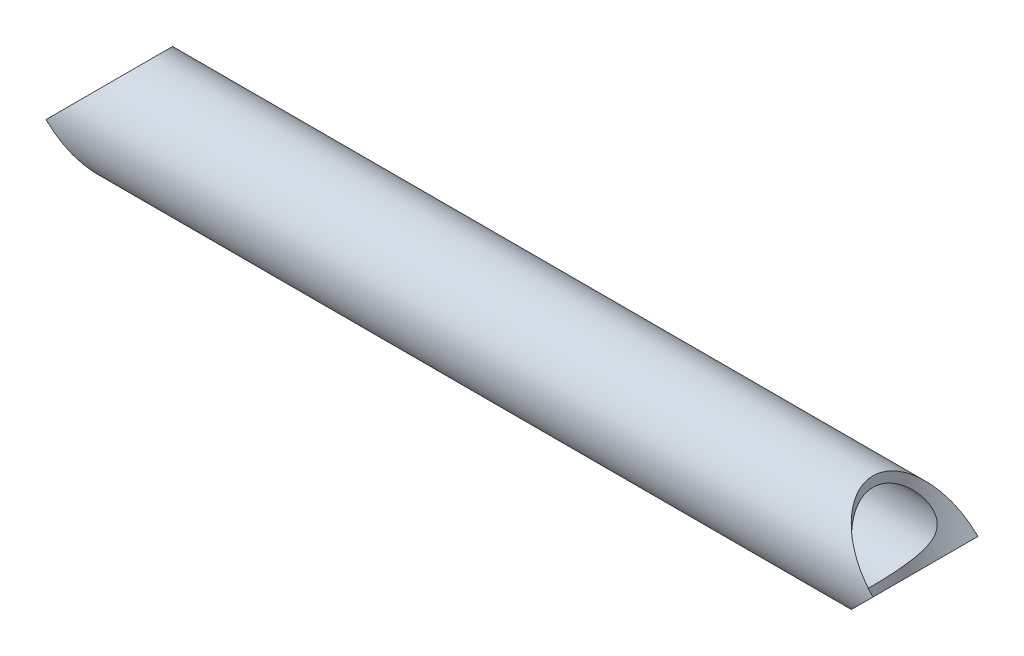
ISO-10303-21;
HEADER;
FILE_DESCRIPTION(('STEP AP214'),'2;1');
FILE_NAME('part.step','',(''),(''),'','','');
FILE_SCHEMA(('AUTOMOTIVE_DESIGN { 1 0 10303 214 1 1 1 1 }'));
ENDSEC;
DATA;
#1=APPLICATION_CONTEXT('core data for automotive mechanical design processes');
#2=APPLICATION_PROTOCOL_DEFINITION('international standard','automotive_design',2000,#1);
#3=PRODUCT_CONTEXT('',#1,'mechanical');
#4=PRODUCT('Part','Part','',(#3));
#5=PRODUCT_RELATED_PRODUCT_CATEGORY('part','',(#4));
#6=PRODUCT_DEFINITION_FORMATION('','',#4);
#7=PRODUCT_DEFINITION_CONTEXT('part definition',#1,'design');
#8=PRODUCT_DEFINITION('design','',#6,#7);
#9=PRODUCT_DEFINITION_SHAPE('','',#8);
#10=(LENGTH_UNIT() NAMED_UNIT(*) SI_UNIT(.MILLI.,.METRE.));
#11=(NAMED_UNIT(*) PLANE_ANGLE_UNIT() SI_UNIT($,.RADIAN.));
#12=(NAMED_UNIT(*) SI_UNIT($,.STERADIAN.) SOLID_ANGLE_UNIT());
#13=UNCERTAINTY_MEASURE_WITH_UNIT(LENGTH_MEASURE(1.E-05),#10,'distance_accuracy_value','');
#14=(GEOMETRIC_REPRESENTATION_CONTEXT(3) GLOBAL_UNCERTAINTY_ASSIGNED_CONTEXT((#13)) GLOBAL_UNIT_ASSIGNED_CONTEXT((#10,
#11,#12)) REPRESENTATION_CONTEXT('',''));
#15=CARTESIAN_POINT('',(0.,0.,0.));
#16=DIRECTION('',(0.,0.,1.));
#17=DIRECTION('',(1.,0.,0.));
#18=AXIS2_PLACEMENT_3D('',#15,#16,#17);
#19=CARTESIAN_POINT('',(-100.,0.,0.));
#20=DIRECTION('',(1.,0.,0.));
#21=DIRECTION('',(0.,0.,-1.));
#22=AXIS2_PLACEMENT_3D('',#19,#20,#21);
#23=CYLINDRICAL_SURFACE('',#22,10.287);
#24=CARTESIAN_POINT('',(-92.552340569011,0.,-10.287));
#25=CARTESIAN_POINT('',(-92.5523357977985,0.189932038780368,-10.2869980864713));
#26=CARTESIAN_POINT('',(-92.5450389268039,0.379911187093797,-10.2817259265039));
#27=CARTESIAN_POINT('',(-92.5162194889371,0.758278685140057,-10.2607666160381));
#28=CARTESIAN_POINT('',(-92.4946883791245,0.94666601070268,-10.2450732110122));
#29=CARTESIAN_POINT('',(-92.4383987012655,1.32078656545176,-10.2035975291257));
#30=CARTESIAN_POINT('',(-92.4036075793362,1.50651208602125,-10.1777904182559));
#31=CARTESIAN_POINT('',(-92.3223278414674,1.87380221431343,-10.1166164775326));
#32=CARTESIAN_POINT('',(-92.2758350072746,2.0553652957456,-10.0812461999905));
#33=CARTESIAN_POINT('',(-92.154363986474,2.47806526049302,-9.98718266907759));
#34=CARTESIAN_POINT('',(-92.0751550435284,2.71713958251239,-9.92467648900176));
#35=CARTESIAN_POINT('',(-91.9026167962832,3.18550993185475,-9.78441290578837));
#36=CARTESIAN_POINT('',(-91.8092809270585,3.4148013491253,-9.70664840695068));
#37=CARTESIAN_POINT('',(-91.6120732005586,3.86400179552905,-9.53675308851912));
#38=CARTESIAN_POINT('',(-91.5081760368868,4.08388640573903,-9.4445874640175));
#39=CARTESIAN_POINT('',(-91.2932416577878,4.51382894794119,-9.24682143685118));
#40=CARTESIAN_POINT('',(-91.1822046513382,4.72388716723352,-9.14122142731193));
#41=CARTESIAN_POINT('',(-90.9120483839777,5.21339845780271,-8.87399278060244));
#42=CARTESIAN_POINT('',(-90.7508549702148,5.4884843840778,-8.70643153948462));
#43=CARTESIAN_POINT('',(-90.4254493939977,6.02068558074217,-8.34726256890771));
#44=CARTESIAN_POINT('',(-90.2612361104094,6.27779399959522,-8.15564574839294));
#45=CARTESIAN_POINT('',(-89.9345828987323,6.77345348102332,-7.74889496500483));
#46=CARTESIAN_POINT('',(-89.7721415659063,7.01202032617912,-7.53378138624917));
#47=CARTESIAN_POINT('',(-89.4530080664348,7.46982637294642,-7.08010215713723));
#48=CARTESIAN_POINT('',(-89.2963139246712,7.68907225156216,-6.84154466936595));
#49=CARTESIAN_POINT('',(-89.0231566368179,8.06452061280443,-6.39167555919362));
#50=CARTESIAN_POINT('',(-88.9049550410172,8.22451787619024,-6.18457777068849));
#51=CARTESIAN_POINT('',(-88.6765955578563,8.53007401828669,-5.75582115307342));
#52=CARTESIAN_POINT('',(-88.5664360902512,8.67563573554793,-5.53416520093129));
#53=CARTESIAN_POINT('',(-88.3562366596023,8.95083608817968,-5.07700660806592));
#54=CARTESIAN_POINT('',(-88.2561847402022,9.08049357672919,-4.84152086109237));
#55=CARTESIAN_POINT('',(-88.0680379114325,9.32254717879241,-4.3572598713759));
#56=CARTESIAN_POINT('',(-87.9799409643452,9.43494623442593,-4.10848690353104));
#57=CARTESIAN_POINT('',(-87.8310418000741,9.62386124792222,-3.64092493675795));
#58=CARTESIAN_POINT('',(-87.768134317647,9.70323790298966,-3.4239592474859));
#59=CARTESIAN_POINT('',(-87.6530955196643,9.84785973139577,-2.98260436332996));
#60=CARTESIAN_POINT('',(-87.6009621134074,9.91310764652366,-2.75821661851252));
#61=CARTESIAN_POINT('',(-87.5084564322107,10.0285703455491,-2.30330043634013));
#62=CARTESIAN_POINT('',(-87.4680801602233,10.0787902386519,-2.07277411506213));
#63=CARTESIAN_POINT('',(-87.3998826974806,10.1634617833374,-1.60699613295693));
#64=CARTESIAN_POINT('',(-87.3720616550315,10.1979132486587,-1.37174441634619));
#65=CARTESIAN_POINT('',(-87.3294957735547,10.2505750218097,-0.897353246506913));
#66=CARTESIAN_POINT('',(-87.3147999972701,10.2687243932203,-0.658202580892907));
#67=CARTESIAN_POINT('',(-87.2989934173221,10.28824427429,-0.178765281690051));
#68=CARTESIAN_POINT('',(-87.297882640544,10.2896147507427,0.0615213541460107));
#69=CARTESIAN_POINT('',(-87.3092712637118,10.2755526164506,0.541278083178366));
#70=CARTESIAN_POINT('',(-87.3217708438044,10.2601197832973,0.78074816552467));
#71=CARTESIAN_POINT('',(-87.3600981544274,10.2127215784355,1.25695705785821));
#72=CARTESIAN_POINT('',(-87.385925535751,10.1807566398909,1.49369593924052));
#73=CARTESIAN_POINT('',(-87.4484554669451,10.1031743830642,1.94894984792973));
#74=CARTESIAN_POINT('',(-87.4844335617574,10.0584649582386,2.1677208797139));
#75=CARTESIAN_POINT('',(-87.5670541198071,9.95547375714236,2.60005985186142));
#76=CARTESIAN_POINT('',(-87.6137002396975,9.89718732698737,2.81362598031304));
#77=CARTESIAN_POINT('',(-87.71684091723,9.76779870432678,3.23433238529809));
#78=CARTESIAN_POINT('',(-87.7733333854667,9.69669923065367,3.44147401415406));
#79=CARTESIAN_POINT('',(-87.8953013614415,9.54244864751585,3.84856473312265));
#80=CARTESIAN_POINT('',(-87.9607801615503,9.45929312037722,4.04851115304196));
#81=CARTESIAN_POINT('',(-88.106237120147,9.27349005922084,4.45870395517475));
#82=CARTESIAN_POINT('',(-88.1869974486118,9.16974888392017,4.66817825019073));
#83=CARTESIAN_POINT('',(-88.356853006859,8.94986555558706,5.07702819229357));
#84=CARTESIAN_POINT('',(-88.4459516659965,8.83371829743013,5.27639963189504));
#85=CARTESIAN_POINT('',(-88.7238962232386,8.46806724593112,5.85868330580118));
#86=CARTESIAN_POINT('',(-88.923448114438,8.20128177036337,6.22592241385102));
#87=CARTESIAN_POINT('',(-89.2578912741026,7.74204241042251,6.77912554925745));
#88=CARTESIAN_POINT('',(-89.3870781203666,7.56201452512019,6.97926547149273));
#89=CARTESIAN_POINT('',(-89.6499548770561,7.18842484325605,7.36346838310403));
#90=CARTESIAN_POINT('',(-89.7836455020296,6.99486089383663,7.5475288045804));
#91=CARTESIAN_POINT('',(-90.053368304194,6.59467509214191,7.89960646030997));
#92=CARTESIAN_POINT('',(-90.1894032631165,6.38803682036848,8.06760282811604));
#93=CARTESIAN_POINT('',(-90.4611668468746,5.96226329985451,8.38717042900703));
#94=CARTESIAN_POINT('',(-90.5968955015107,5.74312932659368,8.53874333392775));
#95=CARTESIAN_POINT('',(-90.8562512705121,5.30745378213158,8.81563383816064));
#96=CARTESIAN_POINT('',(-90.9800809157422,5.09171774322298,8.94202913421709));
#97=CARTESIAN_POINT('',(-91.2223026545912,4.64915627123924,9.17991473059046));
#98=CARTESIAN_POINT('',(-91.3406939314385,4.42232918292647,9.29140279681054));
#99=CARTESIAN_POINT('',(-91.5684871296383,3.95774051111548,9.49859209609348));
#100=CARTESIAN_POINT('',(-91.6779039589112,3.71999812839915,9.5943197874537));
#101=CARTESIAN_POINT('',(-91.8838463633274,3.23309675890485,9.76914962163559));
#102=CARTESIAN_POINT('',(-91.9803785440486,2.98394371071973,9.84826029553734));
#103=CARTESIAN_POINT('',(-92.1269220469652,2.5580357417044,9.96545810928555));
#104=CARTESIAN_POINT('',(-92.1818117292563,2.38431288877448,10.008493053683));
#105=CARTESIAN_POINT('',(-92.281898049268,2.03222306759326,10.085876460149));
#106=CARTESIAN_POINT('',(-92.3270979502389,1.8538576855821,10.1202278472998));
#107=CARTESIAN_POINT('',(-92.4061090675009,1.49344632778608,10.1796497879095));
#108=CARTESIAN_POINT('',(-92.4399423672013,1.31140822587645,10.2047383469975));
#109=CARTESIAN_POINT('',(-92.4949024275909,0.944334965128806,10.2452273903117));
#110=CARTESIAN_POINT('',(-92.5160295207486,0.759299884839344,10.2606281280283));
#111=CARTESIAN_POINT('',(-92.5446651980679,0.386265398595414,10.2814544791157));
#112=CARTESIAN_POINT('',(-92.5520752237122,0.198254254752728,10.2868079053105));
#113=CARTESIAN_POINT('',(-92.5525918580423,-0.177792607936595,10.2871819197326));
#114=CARTESIAN_POINT('',(-92.5456988299599,-0.365828326037898,10.2822027703598));
#115=CARTESIAN_POINT('',(-92.5179527798881,-0.740507651821639,10.2620299180487));
#116=CARTESIAN_POINT('',(-92.4970844429812,-0.927149504897394,10.246825009079));
#117=CARTESIAN_POINT('',(-92.442393957883,-1.29743738558184,10.2065534202554));
#118=CARTESIAN_POINT('',(-92.4085698036928,-1.48108294466968,10.1814852132128));
#119=CARTESIAN_POINT('',(-92.320436127666,-1.8855702790072,10.1152353436888));
#120=CARTESIAN_POINT('',(-92.263219041822,-2.10538972701462,10.0716873800548));
#121=CARTESIAN_POINT('',(-92.1345498184328,-2.53778726680189,9.97152552255302));
#122=CARTESIAN_POINT('',(-92.0630905748703,-2.75036168147748,9.9149051040392));
#123=CARTESIAN_POINT('',(-91.9088110784812,-3.16820342450253,9.78941075306115));
#124=CARTESIAN_POINT('',(-91.8259635735779,-3.3734516908193,9.72050730626211));
#125=CARTESIAN_POINT('',(-91.6517717162026,-3.77600333383638,9.57132435513086));
#126=CARTESIAN_POINT('',(-91.5604269175143,-3.9733062925261,9.49104425326294));
#127=CARTESIAN_POINT('',(-91.3244819230388,-4.456580893282,9.27695087548648));
#128=CARTESIAN_POINT('',(-91.1760382275709,-4.73770956677506,9.13640455258402));
#129=CARTESIAN_POINT('',(-90.871655789844,-5.28300727582608,8.83231020337093));
#130=CARTESIAN_POINT('',(-90.7157136680097,-5.54716853640638,8.66875174019354));
#131=CARTESIAN_POINT('',(-90.4011519622603,-6.05896086125925,8.31910381795196));
#132=CARTESIAN_POINT('',(-90.2425296428146,-6.30657357641017,8.13298997192597));
#133=CARTESIAN_POINT('',(-89.9269452530042,-6.78461437241087,7.73869154256376));
#134=CARTESIAN_POINT('',(-89.7699829068158,-7.01504534796445,7.53051069135606));
#135=CARTESIAN_POINT('',(-89.4582328051086,-7.46240290838807,7.08773158460243));
#136=CARTESIAN_POINT('',(-89.3035535257691,-7.67896133390047,6.85268358287048));
#137=CARTESIAN_POINT('',(-89.0033894544433,-8.09184076525126,6.35985883493025));
#138=CARTESIAN_POINT('',(-88.8579061643975,-8.28815846854912,6.102078392315));
#139=CARTESIAN_POINT('',(-88.5802153164672,-8.65786874998211,5.56503943044338));
#140=CARTESIAN_POINT('',(-88.4479732521329,-8.83132130912193,5.28584027343918));
#141=CARTESIAN_POINT('',(-88.2000792532639,-9.15319780581288,4.70648419838273));
#142=CARTESIAN_POINT('',(-88.0844182192624,-9.30163547913932,4.40633891082294));
#143=CARTESIAN_POINT('',(-87.906989533717,-9.52766879850989,3.88572351480877));
#144=CARTESIAN_POINT('',(-87.8397902153676,-9.61276922730955,3.67032686788154));
#145=CARTESIAN_POINT('',(-87.7159195356389,-9.7689954440067,3.2316057777219));
#146=CARTESIAN_POINT('',(-87.6592454153687,-9.84012489429393,3.0082834303265));
#147=CARTESIAN_POINT('',(-87.5574871149742,-9.96744493324417,2.55495785129186));
#148=CARTESIAN_POINT('',(-87.5123968750543,-10.0236433332127,2.32495818309123));
#149=CARTESIAN_POINT('',(-87.4346670137601,-10.1203156567961,1.85958387171439));
#150=CARTESIAN_POINT('',(-87.4020277981122,-10.1607890680006,1.62420905364958));
#151=CARTESIAN_POINT('',(-87.3497874068493,-10.2254884602312,1.14872542171499));
#152=CARTESIAN_POINT('',(-87.3302442396564,-10.2496421575973,0.90860033329174));
#153=CARTESIAN_POINT('',(-87.3048694821257,-10.2809918293724,0.426519171892953));
#154=CARTESIAN_POINT('',(-87.2990378459638,-10.2881878604542,0.184563105039288));
#155=CARTESIAN_POINT('',(-87.3012207857148,-10.2854928403239,-0.29918606296353));
#156=CARTESIAN_POINT('',(-87.3092351585233,-10.2756020397554,-0.540979166451114));
#157=CARTESIAN_POINT('',(-87.3389251373345,-10.2389111736869,-1.0224221306238));
#158=CARTESIAN_POINT('',(-87.3606002845433,-10.2121116760615,-1.26207206301267));
#159=CARTESIAN_POINT('',(-87.4152554774901,-10.1443843583008,-1.72168291687353));
#160=CARTESIAN_POINT('',(-87.4473959225501,-10.1045045743678,-1.9419001892282));
#161=CARTESIAN_POINT('',(-87.5225769696254,-10.0109554755136,-2.37756077115247));
#162=CARTESIAN_POINT('',(-87.5656212636851,-9.95728148978452,-2.59300243677641));
#163=CARTESIAN_POINT('',(-87.6618456299882,-9.83685583678935,-3.01784451352763));
#164=CARTESIAN_POINT('',(-87.7150248322908,-9.77010529195024,-3.22724544139331));
#165=CARTESIAN_POINT('',(-87.8306624535782,-9.62429818740119,-3.63909198727334));
#166=CARTESIAN_POINT('',(-87.8931221032795,-9.54523999545924,-3.84153667840289));
#167=CARTESIAN_POINT('',(-88.0317314834575,-9.368833324329,-4.25461076280862));
#168=CARTESIAN_POINT('',(-88.1085768380345,-9.27052735131761,-4.46459824130135));
#169=CARTESIAN_POINT('',(-88.2707741456757,-9.06153570630371,-4.87483108046095));
#170=CARTESIAN_POINT('',(-88.3561265391496,-8.95084939333415,-5.07507593595235));
#171=CARTESIAN_POINT('',(-88.623207476573,-8.60153904994493,-5.66059464225386));
#172=CARTESIAN_POINT('',(-88.8160033269466,-8.34560887235322,-6.03077888833571));
#173=CARTESIAN_POINT('',(-89.1400502778151,-7.90464395913558,-6.58865181596339));
#174=CARTESIAN_POINT('',(-89.2651428383055,-7.7320974867895,-6.79019609286956));
#175=CARTESIAN_POINT('',(-89.5203231705343,-7.37372683550692,-7.17775105621994));
#176=CARTESIAN_POINT('',(-89.6504103641271,-7.18790419120179,-7.36376353265673));
#177=CARTESIAN_POINT('',(-89.9136410569868,-6.80343135689891,-7.72040054485716));
#178=CARTESIAN_POINT('',(-90.0467890116567,-6.60476158898695,-7.89100059777087));
#179=CARTESIAN_POINT('',(-90.3136715778325,-6.19527685832252,-8.21640427541267));
#180=CARTESIAN_POINT('',(-90.4474061497121,-5.98446270460562,-8.37120895049876));
#181=CARTESIAN_POINT('',(-90.7127012447032,-5.55117899543202,-8.66459002554809));
#182=CARTESIAN_POINT('',(-90.8442650899824,-5.32872995542221,-8.80319368294449));
#183=CARTESIAN_POINT('',(-91.1025136875211,-4.87167555130491,-9.06412854269739));
#184=CARTESIAN_POINT('',(-91.2291974197734,-4.63706766961733,-9.18645635616172));
#185=CARTESIAN_POINT('',(-91.4738712575166,-4.15573105229372,-9.41397823295496));
#186=CARTESIAN_POINT('',(-91.5918733369115,-3.90901982404247,-9.51919614672524));
#187=CARTESIAN_POINT('',(-91.8147998253919,-3.40315983807797,-9.71154758550382));
#188=CARTESIAN_POINT('',(-91.9197321116809,-3.14401870364818,-9.79869202472296));
#189=CARTESIAN_POINT('',(-92.1418548445237,-2.52771364546421,-9.97827900178999));
#190=CARTESIAN_POINT('',(-92.2521988728687,-2.16574811286747,-10.0634713101814));
#191=CARTESIAN_POINT('',(-92.382403162402,-1.61014331534324,-10.1619468321322));
#192=CARTESIAN_POINT('',(-92.4198929219675,-1.42308824751273,-10.1898688536328));
#193=CARTESIAN_POINT('',(-92.4815983590666,-1.04560404077382,-10.2354838849534));
#194=CARTESIAN_POINT('',(-92.5058227165629,-0.855177192550054,-10.2531835839704));
#195=CARTESIAN_POINT('',(-92.5326016618138,-0.553617252295103,-10.2726868111946));
#196=CARTESIAN_POINT('',(-92.539989489433,-0.443113571684794,-10.2780485043509));
#197=CARTESIAN_POINT('',(-92.5498609016736,-0.221745330807059,-10.285206068797));
#198=CARTESIAN_POINT('',(-92.5523433544038,-0.11088069316035,-10.2870011171016));
#199=CARTESIAN_POINT('',(-92.552340569011,0.,-10.287));
#200=B_SPLINE_CURVE_WITH_KNOTS('',3,(#24,#25,#26,#27,#28,#29,#30,#31,#32,#33,#34,#35,#36,#37,
#38,#39,#40,#41,#42,#43,#44,#45,#46,#47,#48,#49,#50,#51,#52,#53,#54,#55,#56,#57,#58,#59,#60,#61,
#62,#63,#64,#65,#66,#67,#68,#69,#70,#71,#72,#73,#74,#75,#76,#77,#78,#79,#80,#81,#82,#83,#84,#85,
#86,#87,#88,#89,#90,#91,#92,#93,#94,#95,#96,#97,#98,#99,#100,#101,#102,#103,#104,#105,#106,#107,
#108,#109,#110,#111,#112,#113,#114,#115,#116,#117,#118,#119,#120,#121,#122,#123,#124,#125,#126,
#127,#128,#129,#130,#131,#132,#133,#134,#135,#136,#137,#138,#139,#140,#141,#142,#143,#144,#145,
#146,#147,#148,#149,#150,#151,#152,#153,#154,#155,#156,#157,#158,#159,#160,#161,#162,#163,#164,
#165,#166,#167,#168,#169,#170,#171,#172,#173,#174,#175,#176,#177,#178,#179,#180,#181,#182,#183,
#184,#185,#186,#187,#188,#189,#190,#191,#192,#193,#194,#195,#196,#197,#198,#199),.UNSPECIFIED.,
.T.,.F.,(4,2,2,2,2,2,2,2,2,2,2,2,2,2,2,2,2,2,2,2,2,2,2,2,2,2,2,2,2,2,2,2,2,2,2,2,2,2,2,2,2,2,2,
2,2,2,2,2,2,2,2,2,2,2,2,2,2,2,2,2,2,2,2,2,2,2,2,2,2,2,2,2,2,2,2,2,2,2,2,2,2,2,2,2,2,2,2,4),(0.,
0.569669790461824,1.13968178949951,1.71110230118809,2.28272909528938,3.05996911196589,
3.83757143523043,4.61708301012321,5.39657177970072,6.47572664974661,7.55529058740046,
8.63392530079339,9.71218578211876,10.5728967918908,11.4334382177549,12.2929494754071,
13.1523140453827,13.8699194110019,14.5873853948057,15.3046071777089,16.021837432436,
16.7417376340033,17.4616392602954,18.1815504153245,18.9014427086509,19.5792280401887,
20.2572460436827,20.9351203458408,21.6132436707789,22.3544487809388,23.0959600819772,
24.578439561217,25.473585819129,26.3688747717472,27.2653112990452,28.1616564871742,
28.9980963863368,29.8346614997935,30.6698075537227,31.5045237948634,32.065693756976,
32.6266744346484,33.1865588310989,33.7464285770695,34.310305659209,34.8741684216424,
35.4386501094645,36.0032192335034,36.6959797271646,37.3890867376777,38.0838822011838,
38.7787141709447,39.8200103936678,40.8617804147451,41.9046870222231,42.9474175265166,
44.0112726530454,45.0753010877656,46.136480275765,47.1970748537868,47.9198454014615,
48.642426226514,49.3646282795771,50.0868538641477,50.8122577372525,51.5376591860412,
52.2630499941405,52.9884164414556,53.6659568183127,54.3437269177826,55.0214388662977,
55.6992407692071,56.4312960728101,57.1633892946535,58.6271465132391,59.5065221966277,
60.3857963943709,61.2664436354676,62.1470322772348,63.0261173702596,63.9053852174305,
64.783416698235,65.6609163994708,66.8195987175696,67.3974121232853,67.9748469946808,
68.307338614346,68.6399069458636),.UNSPECIFIED.);
#201=CARTESIAN_POINT('',(-92.552340569011,0.,-10.287));
#202=VERTEX_POINT('',#201);
#203=EDGE_CURVE('E37',#202,#202,#200,.T.);
#204=ORIENTED_EDGE('',*,*,#203,.F.);
#205=EDGE_LOOP('',(#204));
#206=FACE_BOUND('',#205,.T.);
#207=CARTESIAN_POINT('',(92.552340569011,0.,-10.287));
#208=CARTESIAN_POINT('',(92.5523357977985,-0.189932038780368,-10.2869980864713));
#209=CARTESIAN_POINT('',(92.5450389268039,-0.379911187093797,-10.2817259265039));
#210=CARTESIAN_POINT('',(92.5162194889371,-0.758278685140057,-10.2607666160381));
#211=CARTESIAN_POINT('',(92.4946883791245,-0.94666601070268,-10.2450732110122));
#212=CARTESIAN_POINT('',(92.4383987012655,-1.32078656545176,-10.2035975291257));
#213=CARTESIAN_POINT('',(92.4036075793362,-1.50651208602125,-10.1777904182559));
#214=CARTESIAN_POINT('',(92.3223278414674,-1.87380221431343,-10.1166164775326));
#215=CARTESIAN_POINT('',(92.2758350072746,-2.0553652957456,-10.0812461999905));
#216=CARTESIAN_POINT('',(92.154363986474,-2.47806526049302,-9.98718266907759));
#217=CARTESIAN_POINT('',(92.0751550435284,-2.71713958251239,-9.92467648900176));
#218=CARTESIAN_POINT('',(91.9026167962832,-3.18550993185475,-9.78441290578837));
#219=CARTESIAN_POINT('',(91.8092809270585,-3.4148013491253,-9.70664840695068));
#220=CARTESIAN_POINT('',(91.6120732005586,-3.86400179552905,-9.53675308851912));
#221=CARTESIAN_POINT('',(91.5081760368868,-4.08388640573903,-9.4445874640175));
#222=CARTESIAN_POINT('',(91.2932416577878,-4.51382894794119,-9.24682143685118));
#223=CARTESIAN_POINT('',(91.1822046513382,-4.72388716723352,-9.14122142731193));
#224=CARTESIAN_POINT('',(90.9120483839777,-5.21339845780271,-8.87399278060244));
#225=CARTESIAN_POINT('',(90.7508549702148,-5.4884843840778,-8.70643153948462));
#226=CARTESIAN_POINT('',(90.4254493939977,-6.02068558074217,-8.34726256890771));
#227=CARTESIAN_POINT('',(90.2612361104094,-6.27779399959522,-8.15564574839294));
#228=CARTESIAN_POINT('',(89.9345828987323,-6.77345348102332,-7.74889496500483));
#229=CARTESIAN_POINT('',(89.7721415659063,-7.01202032617912,-7.53378138624917));
#230=CARTESIAN_POINT('',(89.4530080664348,-7.46982637294642,-7.08010215713723));
#231=CARTESIAN_POINT('',(89.2963139246712,-7.68907225156216,-6.84154466936595));
#232=CARTESIAN_POINT('',(89.0231566368179,-8.06452061280443,-6.39167555919362));
#233=CARTESIAN_POINT('',(88.9049550410172,-8.22451787619024,-6.18457777068849));
#234=CARTESIAN_POINT('',(88.6765955578563,-8.53007401828669,-5.75582115307342));
#235=CARTESIAN_POINT('',(88.5664360902512,-8.67563573554793,-5.53416520093129));
#236=CARTESIAN_POINT('',(88.3562366596023,-8.95083608817968,-5.07700660806592));
#237=CARTESIAN_POINT('',(88.2561847402022,-9.08049357672919,-4.84152086109237));
#238=CARTESIAN_POINT('',(88.0680379114325,-9.32254717879241,-4.3572598713759));
#239=CARTESIAN_POINT('',(87.9799409643452,-9.43494623442593,-4.10848690353104));
#240=CARTESIAN_POINT('',(87.8310418000741,-9.62386124792222,-3.64092493675795));
#241=CARTESIAN_POINT('',(87.768134317647,-9.70323790298966,-3.4239592474859));
#242=CARTESIAN_POINT('',(87.6530955196643,-9.84785973139577,-2.98260436332996));
#243=CARTESIAN_POINT('',(87.6009621134074,-9.91310764652366,-2.75821661851252));
#244=CARTESIAN_POINT('',(87.5084564322107,-10.0285703455491,-2.30330043634013));
#245=CARTESIAN_POINT('',(87.4680801602233,-10.0787902386519,-2.07277411506213));
#246=CARTESIAN_POINT('',(87.3998826974806,-10.1634617833374,-1.60699613295693));
#247=CARTESIAN_POINT('',(87.3720616550315,-10.1979132486587,-1.37174441634619));
#248=CARTESIAN_POINT('',(87.3294957735547,-10.2505750218097,-0.897353246506913));
#249=CARTESIAN_POINT('',(87.3147999972701,-10.2687243932203,-0.658202580892907));
#250=CARTESIAN_POINT('',(87.2989934173221,-10.28824427429,-0.178765281690051));
#251=CARTESIAN_POINT('',(87.297882640544,-10.2896147507427,0.0615213541460107));
#252=CARTESIAN_POINT('',(87.3092712637118,-10.2755526164506,0.541278083178366));
#253=CARTESIAN_POINT('',(87.3217708438044,-10.2601197832973,0.78074816552467));
#254=CARTESIAN_POINT('',(87.3600981544274,-10.2127215784355,1.25695705785821));
#255=CARTESIAN_POINT('',(87.385925535751,-10.1807566398909,1.49369593924052));
#256=CARTESIAN_POINT('',(87.4484554669451,-10.1031743830642,1.94894984792973));
#257=CARTESIAN_POINT('',(87.4844335617574,-10.0584649582386,2.1677208797139));
#258=CARTESIAN_POINT('',(87.5670541198071,-9.95547375714236,2.60005985186142));
#259=CARTESIAN_POINT('',(87.6137002396975,-9.89718732698737,2.81362598031304));
#260=CARTESIAN_POINT('',(87.71684091723,-9.76779870432678,3.23433238529809));
#261=CARTESIAN_POINT('',(87.7733333854667,-9.69669923065367,3.44147401415406));
#262=CARTESIAN_POINT('',(87.8953013614415,-9.54244864751585,3.84856473312265));
#263=CARTESIAN_POINT('',(87.9607801615503,-9.45929312037722,4.04851115304196));
#264=CARTESIAN_POINT('',(88.106237120147,-9.27349005922084,4.45870395517475));
#265=CARTESIAN_POINT('',(88.1869974486118,-9.16974888392017,4.66817825019073));
#266=CARTESIAN_POINT('',(88.356853006859,-8.94986555558706,5.07702819229357));
#267=CARTESIAN_POINT('',(88.4459516659965,-8.83371829743013,5.27639963189504));
#268=CARTESIAN_POINT('',(88.7238962232386,-8.46806724593112,5.85868330580118));
#269=CARTESIAN_POINT('',(88.923448114438,-8.20128177036337,6.22592241385102));
#270=CARTESIAN_POINT('',(89.2578912741026,-7.74204241042251,6.77912554925745));
#271=CARTESIAN_POINT('',(89.3870781203666,-7.56201452512019,6.97926547149273));
#272=CARTESIAN_POINT('',(89.6499548770561,-7.18842484325605,7.36346838310403));
#273=CARTESIAN_POINT('',(89.7836455020296,-6.99486089383663,7.5475288045804));
#274=CARTESIAN_POINT('',(90.053368304194,-6.59467509214191,7.89960646030997));
#275=CARTESIAN_POINT('',(90.1894032631165,-6.38803682036848,8.06760282811604));
#276=CARTESIAN_POINT('',(90.4611668468746,-5.96226329985451,8.38717042900703));
#277=CARTESIAN_POINT('',(90.5968955015107,-5.74312932659368,8.53874333392775));
#278=CARTESIAN_POINT('',(90.8562512705121,-5.30745378213158,8.81563383816064));
#279=CARTESIAN_POINT('',(90.9800809157422,-5.09171774322298,8.94202913421709));
#280=CARTESIAN_POINT('',(91.2223026545912,-4.64915627123924,9.17991473059046));
#281=CARTESIAN_POINT('',(91.3406939314385,-4.42232918292647,9.29140279681054));
#282=CARTESIAN_POINT('',(91.5684871296383,-3.95774051111548,9.49859209609348));
#283=CARTESIAN_POINT('',(91.6779039589112,-3.71999812839915,9.5943197874537));
#284=CARTESIAN_POINT('',(91.8838463633274,-3.23309675890485,9.76914962163559));
#285=CARTESIAN_POINT('',(91.9803785440486,-2.98394371071973,9.84826029553734));
#286=CARTESIAN_POINT('',(92.1269220469652,-2.5580357417044,9.96545810928555));
#287=CARTESIAN_POINT('',(92.1818117292563,-2.38431288877448,10.008493053683));
#288=CARTESIAN_POINT('',(92.281898049268,-2.03222306759326,10.085876460149));
#289=CARTESIAN_POINT('',(92.3270979502389,-1.8538576855821,10.1202278472998));
#290=CARTESIAN_POINT('',(92.4061090675009,-1.49344632778608,10.1796497879095));
#291=CARTESIAN_POINT('',(92.4399423672013,-1.31140822587645,10.2047383469975));
#292=CARTESIAN_POINT('',(92.4949024275909,-0.944334965128806,10.2452273903117));
#293=CARTESIAN_POINT('',(92.5160295207486,-0.759299884839344,10.2606281280283));
#294=CARTESIAN_POINT('',(92.5446651980679,-0.386265398595414,10.2814544791157));
#295=CARTESIAN_POINT('',(92.5520752237122,-0.198254254752728,10.2868079053105));
#296=CARTESIAN_POINT('',(92.5525918580423,0.177792607936595,10.2871819197326));
#297=CARTESIAN_POINT('',(92.5456988299599,0.365828326037898,10.2822027703598));
#298=CARTESIAN_POINT('',(92.5179527798881,0.740507651821639,10.2620299180487));
#299=CARTESIAN_POINT('',(92.4970844429812,0.927149504897394,10.246825009079));
#300=CARTESIAN_POINT('',(92.442393957883,1.29743738558184,10.2065534202554));
#301=CARTESIAN_POINT('',(92.4085698036928,1.48108294466968,10.1814852132128));
#302=CARTESIAN_POINT('',(92.320436127666,1.8855702790072,10.1152353436888));
#303=CARTESIAN_POINT('',(92.263219041822,2.10538972701462,10.0716873800548));
#304=CARTESIAN_POINT('',(92.1345498184328,2.53778726680189,9.97152552255302));
#305=CARTESIAN_POINT('',(92.0630905748703,2.75036168147748,9.9149051040392));
#306=CARTESIAN_POINT('',(91.9088110784812,3.16820342450253,9.78941075306115));
#307=CARTESIAN_POINT('',(91.8259635735779,3.3734516908193,9.72050730626211));
#308=CARTESIAN_POINT('',(91.6517717162026,3.77600333383638,9.57132435513086));
#309=CARTESIAN_POINT('',(91.5604269175143,3.9733062925261,9.49104425326294));
#310=CARTESIAN_POINT('',(91.3244819230388,4.456580893282,9.27695087548648));
#311=CARTESIAN_POINT('',(91.1760382275709,4.73770956677506,9.13640455258402));
#312=CARTESIAN_POINT('',(90.871655789844,5.28300727582608,8.83231020337093));
#313=CARTESIAN_POINT('',(90.7157136680097,5.54716853640638,8.66875174019354));
#314=CARTESIAN_POINT('',(90.4011519622603,6.05896086125925,8.31910381795196));
#315=CARTESIAN_POINT('',(90.2425296428146,6.30657357641017,8.13298997192597));
#316=CARTESIAN_POINT('',(89.9269452530042,6.78461437241087,7.73869154256376));
#317=CARTESIAN_POINT('',(89.7699829068158,7.01504534796445,7.53051069135606));
#318=CARTESIAN_POINT('',(89.4582328051086,7.46240290838807,7.08773158460243));
#319=CARTESIAN_POINT('',(89.3035535257691,7.67896133390047,6.85268358287048));
#320=CARTESIAN_POINT('',(89.0033894544433,8.09184076525126,6.35985883493025));
#321=CARTESIAN_POINT('',(88.8579061643975,8.28815846854912,6.102078392315));
#322=CARTESIAN_POINT('',(88.5802153164672,8.65786874998211,5.56503943044338));
#323=CARTESIAN_POINT('',(88.4479732521329,8.83132130912193,5.28584027343918));
#324=CARTESIAN_POINT('',(88.2000792532639,9.15319780581288,4.70648419838273));
#325=CARTESIAN_POINT('',(88.0844182192624,9.30163547913932,4.40633891082294));
#326=CARTESIAN_POINT('',(87.906989533717,9.52766879850989,3.88572351480877));
#327=CARTESIAN_POINT('',(87.8397902153676,9.61276922730955,3.67032686788154));
#328=CARTESIAN_POINT('',(87.7159195356389,9.7689954440067,3.2316057777219));
#329=CARTESIAN_POINT('',(87.6592454153687,9.84012489429393,3.0082834303265));
#330=CARTESIAN_POINT('',(87.5574871149742,9.96744493324417,2.55495785129186));
#331=CARTESIAN_POINT('',(87.5123968750543,10.0236433332127,2.32495818309123));
#332=CARTESIAN_POINT('',(87.4346670137601,10.1203156567961,1.85958387171439));
#333=CARTESIAN_POINT('',(87.4020277981122,10.1607890680006,1.62420905364958));
#334=CARTESIAN_POINT('',(87.3497874068493,10.2254884602312,1.14872542171499));
#335=CARTESIAN_POINT('',(87.3302442396564,10.2496421575973,0.90860033329174));
#336=CARTESIAN_POINT('',(87.3048694821257,10.2809918293724,0.426519171892953));
#337=CARTESIAN_POINT('',(87.2990378459638,10.2881878604542,0.184563105039288));
#338=CARTESIAN_POINT('',(87.3012207857148,10.2854928403239,-0.29918606296353));
#339=CARTESIAN_POINT('',(87.3092351585233,10.2756020397554,-0.540979166451114));
#340=CARTESIAN_POINT('',(87.3389251373345,10.2389111736869,-1.0224221306238));
#341=CARTESIAN_POINT('',(87.3606002845433,10.2121116760615,-1.26207206301267));
#342=CARTESIAN_POINT('',(87.4152554774901,10.1443843583008,-1.72168291687353));
#343=CARTESIAN_POINT('',(87.4473959225501,10.1045045743678,-1.9419001892282));
#344=CARTESIAN_POINT('',(87.5225769696254,10.0109554755136,-2.37756077115247));
#345=CARTESIAN_POINT('',(87.5656212636851,9.95728148978452,-2.59300243677641));
#346=CARTESIAN_POINT('',(87.6618456299882,9.83685583678935,-3.01784451352763));
#347=CARTESIAN_POINT('',(87.7150248322908,9.77010529195024,-3.22724544139331));
#348=CARTESIAN_POINT('',(87.8306624535782,9.62429818740119,-3.63909198727334));
#349=CARTESIAN_POINT('',(87.8931221032795,9.54523999545924,-3.84153667840289));
#350=CARTESIAN_POINT('',(88.0317314834575,9.368833324329,-4.25461076280862));
#351=CARTESIAN_POINT('',(88.1085768380345,9.27052735131761,-4.46459824130135));
#352=CARTESIAN_POINT('',(88.2707741456757,9.06153570630371,-4.87483108046095));
#353=CARTESIAN_POINT('',(88.3561265391496,8.95084939333415,-5.07507593595235));
#354=CARTESIAN_POINT('',(88.623207476573,8.60153904994493,-5.66059464225386));
#355=CARTESIAN_POINT('',(88.8160033269466,8.34560887235322,-6.03077888833571));
#356=CARTESIAN_POINT('',(89.1400502778151,7.90464395913558,-6.58865181596339));
#357=CARTESIAN_POINT('',(89.2651428383055,7.7320974867895,-6.79019609286956));
#358=CARTESIAN_POINT('',(89.5203231705343,7.37372683550692,-7.17775105621994));
#359=CARTESIAN_POINT('',(89.6504103641271,7.18790419120179,-7.36376353265673));
#360=CARTESIAN_POINT('',(89.9136410569868,6.80343135689891,-7.72040054485716));
#361=CARTESIAN_POINT('',(90.0467890116567,6.60476158898695,-7.89100059777087));
#362=CARTESIAN_POINT('',(90.3136715778325,6.19527685832252,-8.21640427541267));
#363=CARTESIAN_POINT('',(90.4474061497121,5.98446270460562,-8.37120895049876));
#364=CARTESIAN_POINT('',(90.7127012447032,5.55117899543202,-8.66459002554809));
#365=CARTESIAN_POINT('',(90.8442650899824,5.32872995542221,-8.80319368294449));
#366=CARTESIAN_POINT('',(91.1025136875211,4.87167555130491,-9.06412854269739));
#367=CARTESIAN_POINT('',(91.2291974197734,4.63706766961733,-9.18645635616172));
#368=CARTESIAN_POINT('',(91.4738712575166,4.15573105229372,-9.41397823295496));
#369=CARTESIAN_POINT('',(91.5918733369115,3.90901982404247,-9.51919614672524));
#370=CARTESIAN_POINT('',(91.8147998253919,3.40315983807797,-9.71154758550382));
#371=CARTESIAN_POINT('',(91.9197321116809,3.14401870364818,-9.79869202472296));
#372=CARTESIAN_POINT('',(92.1418548445237,2.52771364546421,-9.97827900178999));
#373=CARTESIAN_POINT('',(92.2521988728687,2.16574811286747,-10.0634713101814));
#374=CARTESIAN_POINT('',(92.382403162402,1.61014331534324,-10.1619468321322));
#375=CARTESIAN_POINT('',(92.4198929219675,1.42308824751273,-10.1898688536328));
#376=CARTESIAN_POINT('',(92.4815983590666,1.04560404077382,-10.2354838849534));
#377=CARTESIAN_POINT('',(92.5058227165629,0.855177192550054,-10.2531835839704));
#378=CARTESIAN_POINT('',(92.5326016618138,0.553617252295103,-10.2726868111946));
#379=CARTESIAN_POINT('',(92.539989489433,0.443113571684794,-10.2780485043509));
#380=CARTESIAN_POINT('',(92.5498609016736,0.221745330807059,-10.285206068797));
#381=CARTESIAN_POINT('',(92.5523433544038,0.11088069316035,-10.2870011171016));
#382=CARTESIAN_POINT('',(92.552340569011,0.,-10.287));
#383=B_SPLINE_CURVE_WITH_KNOTS('',3,(#207,#208,#209,#210,#211,#212,#213,#214,#215,#216,#217,
#218,#219,#220,#221,#222,#223,#224,#225,#226,#227,#228,#229,#230,#231,#232,#233,#234,#235,#236,
#237,#238,#239,#240,#241,#242,#243,#244,#245,#246,#247,#248,#249,#250,#251,#252,#253,#254,#255,
#256,#257,#258,#259,#260,#261,#262,#263,#264,#265,#266,#267,#268,#269,#270,#271,#272,#273,#274,
#275,#276,#277,#278,#279,#280,#281,#282,#283,#284,#285,#286,#287,#288,#289,#290,#291,#292,#293,
#294,#295,#296,#297,#298,#299,#300,#301,#302,#303,#304,#305,#306,#307,#308,#309,#310,#311,#312,
#313,#314,#315,#316,#317,#318,#319,#320,#321,#322,#323,#324,#325,#326,#327,#328,#329,#330,#331,
#332,#333,#334,#335,#336,#337,#338,#339,#340,#341,#342,#343,#344,#345,#346,#347,#348,#349,#350,
#351,#352,#353,#354,#355,#356,#357,#358,#359,#360,#361,#362,#363,#364,#365,#366,#367,#368,#369,
#370,#371,#372,#373,#374,#375,#376,#377,#378,#379,#380,#381,#382),.UNSPECIFIED.,.T.,.F.,(4,2,2,
2,2,2,2,2,2,2,2,2,2,2,2,2,2,2,2,2,2,2,2,2,2,2,2,2,2,2,2,2,2,2,2,2,2,2,2,2,2,2,2,2,2,2,2,2,2,2,2,
2,2,2,2,2,2,2,2,2,2,2,2,2,2,2,2,2,2,2,2,2,2,2,2,2,2,2,2,2,2,2,2,2,2,2,2,4),(0.,
0.569669790461824,1.13968178949951,1.71110230118809,2.28272909528938,3.05996911196589,
3.83757143523043,4.61708301012321,5.39657177970072,6.47572664974661,7.55529058740046,
8.63392530079339,9.71218578211876,10.5728967918908,11.4334382177549,12.2929494754071,
13.1523140453827,13.8699194110019,14.5873853948057,15.3046071777089,16.021837432436,
16.7417376340033,17.4616392602954,18.1815504153245,18.9014427086509,19.5792280401887,
20.2572460436827,20.9351203458408,21.6132436707789,22.3544487809388,23.0959600819772,
24.578439561217,25.473585819129,26.3688747717472,27.2653112990452,28.1616564871742,
28.9980963863368,29.8346614997935,30.6698075537227,31.5045237948634,32.065693756976,
32.6266744346484,33.1865588310989,33.7464285770695,34.310305659209,34.8741684216424,
35.4386501094645,36.0032192335034,36.6959797271646,37.3890867376777,38.0838822011838,
38.7787141709447,39.8200103936678,40.8617804147451,41.9046870222231,42.9474175265166,
44.0112726530454,45.0753010877656,46.136480275765,47.1970748537868,47.9198454014615,
48.642426226514,49.3646282795771,50.0868538641477,50.8122577372525,51.5376591860412,
52.2630499941405,52.9884164414556,53.6659568183127,54.3437269177826,55.0214388662977,
55.6992407692071,56.4312960728101,57.1633892946535,58.6271465132391,59.5065221966277,
60.3857963943709,61.2664436354676,62.1470322772348,63.0261173702596,63.9053852174305,
64.783416698235,65.6609163994708,66.8195987175696,67.3974121232853,67.9748469946808,
68.307338614346,68.6399069458636),.UNSPECIFIED.);
#384=CARTESIAN_POINT('',(92.552340569011,0.,-10.287));
#385=VERTEX_POINT('',#384);
#386=EDGE_CURVE('E66',#385,#385,#383,.T.);
#387=ORIENTED_EDGE('',*,*,#386,.F.);
#388=EDGE_LOOP('',(#387));
#389=FACE_BOUND('',#388,.T.);
#390=ADVANCED_FACE('F33',(#206,#389),#23,.F.);
#391=CARTESIAN_POINT('',(-100.,50.,0.));
#392=DIRECTION('',(0.,-1.,0.));
#393=DIRECTION('',(0.,0.,-1.));
#394=AXIS2_PLACEMENT_3D('',#391,#392,#393);
#395=CYLINDRICAL_SURFACE('',#394,12.7);
#396=CARTESIAN_POINT('',(-100.,0.,0.));
#397=DIRECTION('',(0.707106781186547,0.707106781186547,0.));
#398=DIRECTION('',(0.707106781186547,-0.707106781186547,0.));
#399=AXIS2_PLACEMENT_3D('',#396,#397,#398);
#400=ELLIPSE('',#399,17.9605122421383,12.7);
#401=CARTESIAN_POINT('',(-100.,0.,12.7));
#402=VERTEX_POINT('',#401);
#403=CARTESIAN_POINT('',(-100.,0.,-12.7));
#404=VERTEX_POINT('',#403);
#405=EDGE_CURVE('E46',#402,#404,#400,.T.);
#406=ORIENTED_EDGE('',*,*,#405,.F.);
#407=CARTESIAN_POINT('',(-100.,0.,0.));
#408=DIRECTION('',(0.707106781186547,-0.707106781186547,0.));
#409=DIRECTION('',(0.707106781186547,0.707106781186547,0.));
#410=AXIS2_PLACEMENT_3D('',#407,#408,#409);
#411=ELLIPSE('',#410,17.9605122421383,12.7);
#412=EDGE_CURVE('E11',#404,#402,#411,.T.);
#413=ORIENTED_EDGE('',*,*,#412,.F.);
#414=EDGE_LOOP('',(#406,#413));
#415=FACE_BOUND('',#414,.T.);
#416=ORIENTED_EDGE('',*,*,#203,.T.);
#417=EDGE_LOOP('',(#416));
#418=FACE_BOUND('',#417,.T.);
#419=ADVANCED_FACE('F73',(#415,#418),#395,.F.);
#420=CARTESIAN_POINT('',(100.,50.,0.));
#421=DIRECTION('',(0.,-1.,0.));
#422=DIRECTION('',(0.,0.,-1.));
#423=AXIS2_PLACEMENT_3D('',#420,#421,#422);
#424=CYLINDRICAL_SURFACE('',#423,12.7);
#425=CARTESIAN_POINT('',(100.,0.,0.));
#426=DIRECTION('',(0.707106781186547,0.707106781186547,0.));
#427=DIRECTION('',(0.707106781186547,-0.707106781186547,0.));
#428=AXIS2_PLACEMENT_3D('',#425,#426,#427);
#429=ELLIPSE('',#428,17.9605122421383,12.7);
#430=CARTESIAN_POINT('',(100.,0.,12.7));
#431=VERTEX_POINT('',#430);
#432=CARTESIAN_POINT('',(100.,0.,-12.7));
#433=VERTEX_POINT('',#432);
#434=EDGE_CURVE('E62',#431,#433,#429,.F.);
#435=ORIENTED_EDGE('',*,*,#434,.F.);
#436=CARTESIAN_POINT('',(100.,0.,0.));
#437=DIRECTION('',(0.707106781186547,-0.707106781186547,0.));
#438=DIRECTION('',(0.707106781186547,0.707106781186547,0.));
#439=AXIS2_PLACEMENT_3D('',#436,#437,#438);
#440=ELLIPSE('',#439,17.9605122421383,12.7);
#441=EDGE_CURVE('E57',#433,#431,#440,.F.);
#442=ORIENTED_EDGE('',*,*,#441,.F.);
#443=EDGE_LOOP('',(#435,#442));
#444=FACE_BOUND('',#443,.T.);
#445=ORIENTED_EDGE('',*,*,#386,.T.);
#446=EDGE_LOOP('',(#445));
#447=FACE_BOUND('',#446,.T.);
#448=ADVANCED_FACE('F63',(#444,#447),#424,.F.);
#449=CARTESIAN_POINT('',(-100.,0.,0.));
#450=DIRECTION('',(1.,0.,0.));
#451=DIRECTION('',(0.,0.,-1.));
#452=AXIS2_PLACEMENT_3D('',#449,#450,#451);
#453=CYLINDRICAL_SURFACE('',#452,12.7);
#454=ORIENTED_EDGE('',*,*,#405,.T.);
#455=ORIENTED_EDGE('',*,*,#412,.T.);
#456=EDGE_LOOP('',(#454,#455));
#457=FACE_BOUND('',#456,.T.);
#458=ORIENTED_EDGE('',*,*,#434,.T.);
#459=ORIENTED_EDGE('',*,*,#441,.T.);
#460=EDGE_LOOP('',(#458,#459));
#461=FACE_BOUND('',#460,.T.);
#462=ADVANCED_FACE('F35',(#457,#461),#453,.T.);
#463=CLOSED_SHELL('',(#390,#419,#448,#462));
#464=MANIFOLD_SOLID_BREP('B2',#463);
#465=ADVANCED_BREP_SHAPE_REPRESENTATION('',(#18,#464),#14);
#466=SHAPE_DEFINITION_REPRESENTATION(#9,#465);
ENDSEC;
END-ISO-10303-21;
